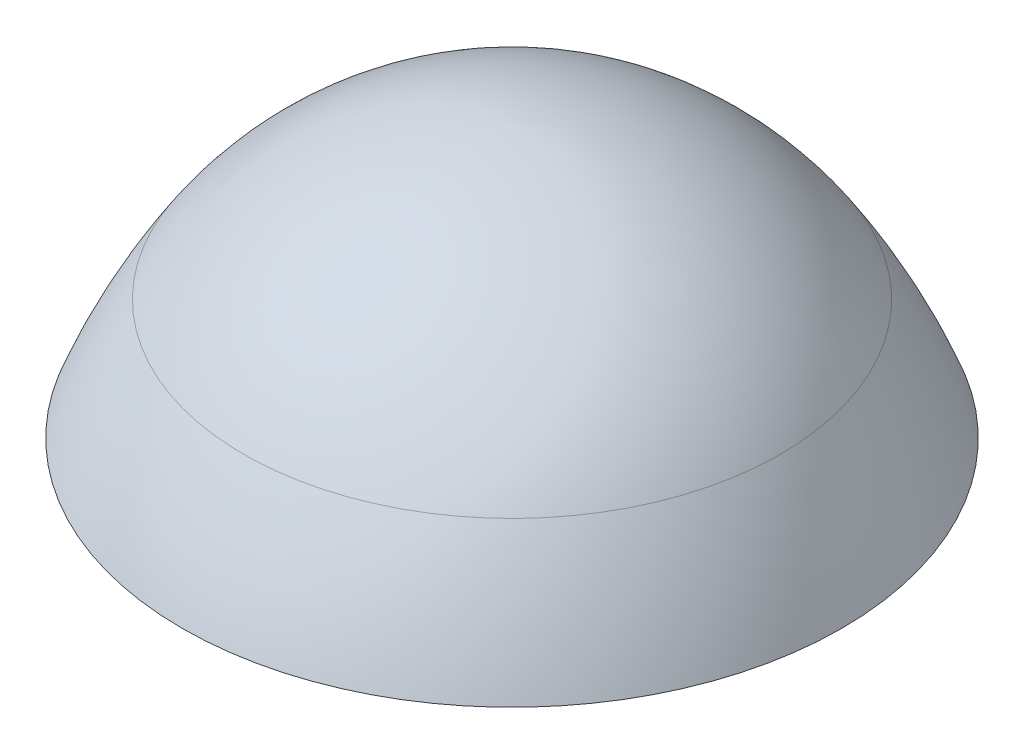
ISO-10303-21;
HEADER;
FILE_DESCRIPTION(('STEP AP214'),'2;1');
FILE_NAME('part.step','',(''),(''),'','','');
FILE_SCHEMA(('AUTOMOTIVE_DESIGN { 1 0 10303 214 1 1 1 1 }'));
ENDSEC;
DATA;
#1=APPLICATION_CONTEXT('core data for automotive mechanical design processes');
#2=APPLICATION_PROTOCOL_DEFINITION('international standard','automotive_design',2000,#1);
#3=PRODUCT_CONTEXT('',#1,'mechanical');
#4=PRODUCT('Part','Part','',(#3));
#5=PRODUCT_RELATED_PRODUCT_CATEGORY('part','',(#4));
#6=PRODUCT_DEFINITION_FORMATION('','',#4);
#7=PRODUCT_DEFINITION_CONTEXT('part definition',#1,'design');
#8=PRODUCT_DEFINITION('design','',#6,#7);
#9=PRODUCT_DEFINITION_SHAPE('','',#8);
#10=(LENGTH_UNIT() NAMED_UNIT(*) SI_UNIT(.MILLI.,.METRE.));
#11=(NAMED_UNIT(*) PLANE_ANGLE_UNIT() SI_UNIT($,.RADIAN.));
#12=(NAMED_UNIT(*) SI_UNIT($,.STERADIAN.) SOLID_ANGLE_UNIT());
#13=UNCERTAINTY_MEASURE_WITH_UNIT(LENGTH_MEASURE(1.E-05),#10,'distance_accuracy_value','');
#14=(GEOMETRIC_REPRESENTATION_CONTEXT(3) GLOBAL_UNCERTAINTY_ASSIGNED_CONTEXT((#13)) GLOBAL_UNIT_ASSIGNED_CONTEXT((#10,
#11,#12)) REPRESENTATION_CONTEXT('',''));
#15=CARTESIAN_POINT('',(0.,0.,0.));
#16=DIRECTION('',(0.,0.,1.));
#17=DIRECTION('',(1.,0.,0.));
#18=AXIS2_PLACEMENT_3D('',#15,#16,#17);
#19=CARTESIAN_POINT('',(0.,0.,0.));
#20=DIRECTION('',(0.,1.,0.));
#21=DIRECTION('',(0.,0.,1.));
#22=AXIS2_PLACEMENT_3D('',#19,#20,#21);
#23=PLANE('',#22);
#24=CARTESIAN_POINT('',(0.,0.,0.));
#25=DIRECTION('',(0.,1.,0.));
#26=DIRECTION('',(0.,0.,1.));
#27=AXIS2_PLACEMENT_3D('',#24,#25,#26);
#28=CIRCLE('',#27,2.30933728796703);
#29=CARTESIAN_POINT('',(0.,0.,2.30933728796703));
#30=VERTEX_POINT('',#29);
#31=EDGE_CURVE('E80',#30,#30,#28,.F.);
#32=ORIENTED_EDGE('',*,*,#31,.F.);
#33=EDGE_LOOP('',(#32));
#34=FACE_BOUND('',#33,.T.);
#35=CARTESIAN_POINT('',(0.,0.,0.));
#36=DIRECTION('',(0.,-1.,0.));
#37=DIRECTION('',(0.,0.,-1.));
#38=AXIS2_PLACEMENT_3D('',#35,#36,#37);
#39=CIRCLE('',#38,4.5);
#40=CARTESIAN_POINT('',(0.,0.,-4.5));
#41=VERTEX_POINT('',#40);
#42=EDGE_CURVE('E11',#41,#41,#39,.T.);
#43=ORIENTED_EDGE('',*,*,#42,.T.);
#44=EDGE_LOOP('',(#43));
#45=FACE_BOUND('',#44,.T.);
#46=ADVANCED_FACE('F43',(#34,#45),#23,.F.);
#47=CARTESIAN_POINT('',(0.,-3.13120140758288,0.));
#48=DIRECTION('',(0.,-1.,0.));
#49=DIRECTION('',(0.,0.,-1.));
#50=AXIS2_PLACEMENT_3D('',#47,#48,#49);
#51=DEGENERATE_TOROIDAL_SURFACE('',#50,3.67228508424042,8.75160932360143,.F.);
#52=ORIENTED_EDGE('',*,*,#42,.F.);
#53=EDGE_LOOP('',(#52));
#54=FACE_BOUND('',#53,.T.);
#55=CARTESIAN_POINT('',(0.,1.64077925256992,0.));
#56=DIRECTION('',(0.,-1.,0.));
#57=DIRECTION('',(0.,0.,-1.));
#58=AXIS2_PLACEMENT_3D('',#55,#56,#57);
#59=CIRCLE('',#58,3.66384920652028);
#60=CARTESIAN_POINT('',(0.,1.64077925256992,-3.66384920652028));
#61=VERTEX_POINT('',#60);
#62=EDGE_CURVE('E51',#61,#61,#59,.T.);
#63=ORIENTED_EDGE('',*,*,#62,.T.);
#64=EDGE_LOOP('',(#63));
#65=FACE_BOUND('',#64,.T.);
#66=ADVANCED_FACE('F71',(#54,#65),#51,.F.);
#67=CARTESIAN_POINT('',(0.,-0.830880535167795,0.135920619733875));
#68=DIRECTION('',(-1.,0.,0.));
#69=DIRECTION('',(0.,0.,-1.));
#70=AXIS2_PLACEMENT_3D('',#67,#68,#69);
#71=CIRCLE('',#70,4.53291879905555);
#72=TRIMMED_CURVE('',#71,(PARAMETER_VALUE(-1.54080660008017)),
(PARAMETER_VALUE(1.54080660008017)),.T.,.PARAMETER.);
#73=CARTESIAN_POINT('',(0.,-0.830880535167795,0.));
#74=DIRECTION('',(0.,-1.,0.));
#75=AXIS1_PLACEMENT('',#73,#74);
#76=SURFACE_OF_REVOLUTION('',#72,#75);
#77=ORIENTED_EDGE('',*,*,#62,.F.);
#78=EDGE_LOOP('',(#77));
#79=FACE_BOUND('',#78,.T.);
#80=CARTESIAN_POINT('',(0.,3.7,0.));
#81=VERTEX_POINT('',#80);
#82=VERTEX_LOOP('',#81);
#83=FACE_BOUND('',#82,.T.);
#84=ADVANCED_FACE('F65',(#79,#83),#76,.T.);
#85=CARTESIAN_POINT('',(0.,-3.13120140758288,0.));
#86=DIRECTION('',(0.,-1.,0.));
#87=DIRECTION('',(0.,0.,-1.));
#88=AXIS2_PLACEMENT_3D('',#85,#86,#87);
#89=DEGENERATE_TOROIDAL_SURFACE('',#88,3.67228508424042,6.75160932360143,.F.);
#90=ORIENTED_EDGE('',*,*,#31,.T.);
#91=EDGE_LOOP('',(#90));
#92=FACE_BOUND('',#91,.T.);
#93=CARTESIAN_POINT('',(0.,0.550241390628653,0.));
#94=DIRECTION('',(0.,-1.,0.));
#95=DIRECTION('',(0.,0.,-1.));
#96=AXIS2_PLACEMENT_3D('',#93,#94,#95);
#97=CIRCLE('',#96,1.98732686200096);
#98=CARTESIAN_POINT('',(0.,0.550241390628653,-1.98732686200096));
#99=VERTEX_POINT('',#98);
#100=EDGE_CURVE('E88',#99,#99,#97,.T.);
#101=ORIENTED_EDGE('',*,*,#100,.F.);
#102=EDGE_LOOP('',(#101));
#103=FACE_BOUND('',#102,.T.);
#104=ADVANCED_FACE('F59',(#92,#103),#89,.T.);
#105=CARTESIAN_POINT('',(0.,-0.830880535167795,0.135920619733875));
#106=DIRECTION('',(-1.,0.,0.));
#107=DIRECTION('',(0.,0.,-1.));
#108=AXIS2_PLACEMENT_3D('',#105,#106,#107);
#109=CIRCLE('',#108,2.53291879905555);
#110=TRIMMED_CURVE('',#109,(PARAMETER_VALUE(-1.51710888261296)),
(PARAMETER_VALUE(1.51710888261296)),.T.,.PARAMETER.);
#111=CARTESIAN_POINT('',(0.,-0.830880535167795,0.));
#112=DIRECTION('',(0.,-1.,0.));
#113=AXIS1_PLACEMENT('',#111,#112);
#114=SURFACE_OF_REVOLUTION('',#110,#113);
#115=ORIENTED_EDGE('',*,*,#100,.T.);
#116=EDGE_LOOP('',(#115));
#117=FACE_BOUND('',#116,.T.);
#118=CARTESIAN_POINT('',(0.,1.69838877191285,0.));
#119=VERTEX_POINT('',#118);
#120=VERTEX_LOOP('',#119);
#121=FACE_BOUND('',#120,.T.);
#122=ADVANCED_FACE('F57',(#117,#121),#114,.F.);
#123=CLOSED_SHELL('',(#46,#66,#84,#104,#122));
#124=MANIFOLD_SOLID_BREP('B2',#123);
#125=ADVANCED_BREP_SHAPE_REPRESENTATION('',(#18,#124),#14);
#126=SHAPE_DEFINITION_REPRESENTATION(#9,#125);
ENDSEC;
END-ISO-10303-21;
